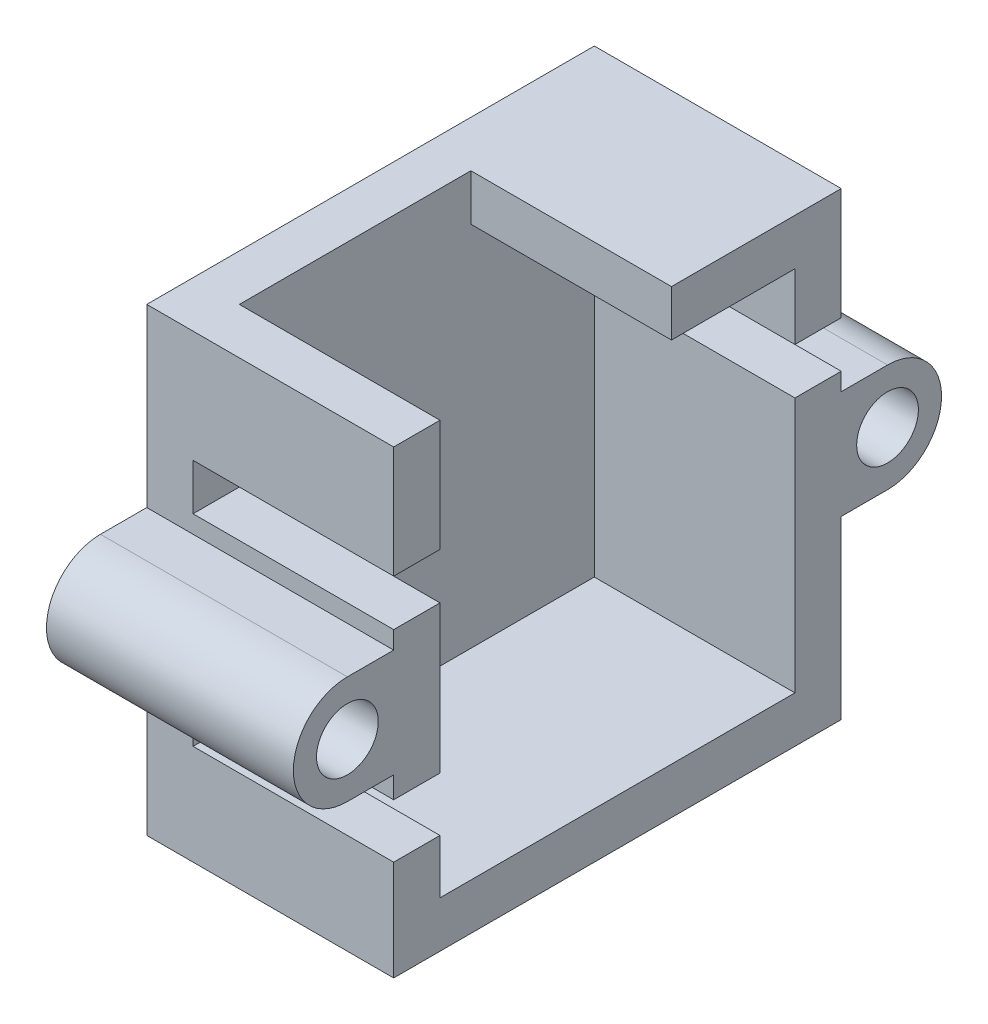
ISO-10303-21;
HEADER;
FILE_DESCRIPTION(('STEP AP214'),'2;1');
FILE_NAME('part.step','',(''),(''),'','','');
FILE_SCHEMA(('AUTOMOTIVE_DESIGN { 1 0 10303 214 1 1 1 1 }'));
ENDSEC;
DATA;
#1=APPLICATION_CONTEXT('core data for automotive mechanical design processes');
#2=APPLICATION_PROTOCOL_DEFINITION('international standard','automotive_design',2000,#1);
#3=PRODUCT_CONTEXT('',#1,'mechanical');
#4=PRODUCT('Part','Part','',(#3));
#5=PRODUCT_RELATED_PRODUCT_CATEGORY('part','',(#4));
#6=PRODUCT_DEFINITION_FORMATION('','',#4);
#7=PRODUCT_DEFINITION_CONTEXT('part definition',#1,'design');
#8=PRODUCT_DEFINITION('design','',#6,#7);
#9=PRODUCT_DEFINITION_SHAPE('','',#8);
#10=(LENGTH_UNIT() NAMED_UNIT(*) SI_UNIT(.MILLI.,.METRE.));
#11=(NAMED_UNIT(*) PLANE_ANGLE_UNIT() SI_UNIT($,.RADIAN.));
#12=(NAMED_UNIT(*) SI_UNIT($,.STERADIAN.) SOLID_ANGLE_UNIT());
#13=UNCERTAINTY_MEASURE_WITH_UNIT(LENGTH_MEASURE(1.E-05),#10,'distance_accuracy_value','');
#14=(GEOMETRIC_REPRESENTATION_CONTEXT(3) GLOBAL_UNCERTAINTY_ASSIGNED_CONTEXT((#13)) GLOBAL_UNIT_ASSIGNED_CONTEXT((#10,
#11,#12)) REPRESENTATION_CONTEXT('',''));
#15=CARTESIAN_POINT('',(0.,0.,0.));
#16=DIRECTION('',(0.,0.,1.));
#17=DIRECTION('',(1.,0.,0.));
#18=AXIS2_PLACEMENT_3D('',#15,#16,#17);
#19=CARTESIAN_POINT('',(13.,-3.,3.));
#20=DIRECTION('',(0.,0.,-1.));
#21=DIRECTION('',(-1.,0.,0.));
#22=AXIS2_PLACEMENT_3D('',#19,#20,#21);
#23=PLANE('',#22);
#24=DIRECTION('',(-1.,0.,0.));
#25=VECTOR('',#24,1.);
#26=CARTESIAN_POINT('',(22.5524865872714,15.4,3.));
#27=LINE('',#26,#25);
#28=CARTESIAN_POINT('',(13.,15.4,3.));
#29=VERTEX_POINT('',#28);
#30=CARTESIAN_POINT('',(-3.,15.4,3.));
#31=VERTEX_POINT('',#30);
#32=EDGE_CURVE('E333',#29,#31,#27,.T.);
#33=ORIENTED_EDGE('',*,*,#32,.F.);
#34=DIRECTION('',(0.,-1.,0.));
#35=VECTOR('',#34,1.);
#36=CARTESIAN_POINT('',(13.,-3.,3.));
#37=LINE('',#36,#35);
#38=CARTESIAN_POINT('',(13.,16.55,3.));
#39=VERTEX_POINT('',#38);
#40=EDGE_CURVE('E514',#39,#29,#37,.T.);
#41=ORIENTED_EDGE('',*,*,#40,.F.);
#42=DIRECTION('',(-1.,0.,0.));
#43=VECTOR('',#42,1.);
#44=CARTESIAN_POINT('',(42.1547594742265,16.55,3.));
#45=LINE('',#44,#43);
#46=CARTESIAN_POINT('',(0.,16.55,3.));
#47=VERTEX_POINT('',#46);
#48=EDGE_CURVE('E430',#39,#47,#45,.T.);
#49=ORIENTED_EDGE('',*,*,#48,.T.);
#50=DIRECTION('',(0.,-1.,0.));
#51=VECTOR('',#50,1.);
#52=CARTESIAN_POINT('',(0.,19.55,3.));
#53=LINE('',#52,#51);
#54=CARTESIAN_POINT('',(0.,19.55,3.));
#55=VERTEX_POINT('',#54);
#56=EDGE_CURVE('E425',#55,#47,#53,.T.);
#57=ORIENTED_EDGE('',*,*,#56,.F.);
#58=DIRECTION('',(-1.,0.,0.));
#59=VECTOR('',#58,1.);
#60=CARTESIAN_POINT('',(42.1547594742265,19.55,3.));
#61=LINE('',#60,#59);
#62=CARTESIAN_POINT('',(13.,19.55,3.));
#63=VERTEX_POINT('',#62);
#64=EDGE_CURVE('E402',#63,#55,#61,.T.);
#65=ORIENTED_EDGE('',*,*,#64,.F.);
#66=CARTESIAN_POINT('',(13.,26.8,3.));
#67=VERTEX_POINT('',#66);
#68=EDGE_CURVE('E508',#67,#63,#37,.T.);
#69=ORIENTED_EDGE('',*,*,#68,.F.);
#70=DIRECTION('',(-1.,0.,0.));
#71=VECTOR('',#70,1.);
#72=CARTESIAN_POINT('',(13.,26.8,3.));
#73=LINE('',#72,#71);
#74=CARTESIAN_POINT('',(-3.,26.8,3.));
#75=VERTEX_POINT('',#74);
#76=EDGE_CURVE('E520',#67,#75,#73,.T.);
#77=ORIENTED_EDGE('',*,*,#76,.T.);
#78=DIRECTION('',(0.,-1.,0.));
#79=VECTOR('',#78,1.);
#80=CARTESIAN_POINT('',(-3.,26.8,3.));
#81=LINE('',#80,#79);
#82=EDGE_CURVE('E448',#75,#31,#81,.T.);
#83=ORIENTED_EDGE('',*,*,#82,.T.);
#84=EDGE_LOOP('',(#33,#41,#49,#57,#65,#69,#77,#83));
#85=FACE_BOUND('',#84,.T.);
#86=ADVANCED_FACE('F100',(#85),#23,.F.);
#87=CARTESIAN_POINT('',(13.,-3.,-26.));
#88=DIRECTION('',(0.,0.,1.));
#89=DIRECTION('',(1.,0.,0.));
#90=AXIS2_PLACEMENT_3D('',#87,#88,#89);
#91=PLANE('',#90);
#92=DIRECTION('',(-1.,0.,0.));
#93=VECTOR('',#92,1.);
#94=CARTESIAN_POINT('',(22.5524865872714,8.4,-26.));
#95=LINE('',#94,#93);
#96=CARTESIAN_POINT('',(13.,8.4,-26.));
#97=VERTEX_POINT('',#96);
#98=CARTESIAN_POINT('',(-3.,8.4,-26.));
#99=VERTEX_POINT('',#98);
#100=EDGE_CURVE('E341',#97,#99,#95,.T.);
#101=ORIENTED_EDGE('',*,*,#100,.F.);
#102=DIRECTION('',(0.,1.,0.));
#103=VECTOR('',#102,1.);
#104=CARTESIAN_POINT('',(13.,-3.,-26.));
#105=LINE('',#104,#103);
#106=CARTESIAN_POINT('',(13.,-3.,-26.));
#107=VERTEX_POINT('',#106);
#108=EDGE_CURVE('E499',#107,#97,#105,.T.);
#109=ORIENTED_EDGE('',*,*,#108,.F.);
#110=DIRECTION('',(-1.,0.,0.));
#111=VECTOR('',#110,1.);
#112=CARTESIAN_POINT('',(13.,-3.,-26.));
#113=LINE('',#112,#111);
#114=CARTESIAN_POINT('',(-3.,-3.,-26.));
#115=VERTEX_POINT('',#114);
#116=EDGE_CURVE('E521',#107,#115,#113,.T.);
#117=ORIENTED_EDGE('',*,*,#116,.T.);
#118=DIRECTION('',(0.,1.,0.));
#119=VECTOR('',#118,1.);
#120=CARTESIAN_POINT('',(-3.,-3.,-26.));
#121=LINE('',#120,#119);
#122=EDGE_CURVE('E456',#115,#99,#121,.T.);
#123=ORIENTED_EDGE('',*,*,#122,.T.);
#124=EDGE_LOOP('',(#101,#109,#117,#123));
#125=FACE_BOUND('',#124,.T.);
#126=ADVANCED_FACE('F603',(#125),#91,.F.);
#127=CARTESIAN_POINT('',(13.,0.,0.));
#128=DIRECTION('',(1.,0.,0.));
#129=DIRECTION('',(0.,0.,-1.));
#130=AXIS2_PLACEMENT_3D('',#127,#128,#129);
#131=PLANE('',#130);
#132=DIRECTION('',(0.,-1.,0.));
#133=VECTOR('',#132,1.);
#134=CARTESIAN_POINT('',(13.,0.,0.));
#135=LINE('',#134,#133);
#136=CARTESIAN_POINT('',(13.,26.8,0.));
#137=VERTEX_POINT('',#136);
#138=CARTESIAN_POINT('',(13.,19.55,0.));
#139=VERTEX_POINT('',#138);
#140=EDGE_CURVE('E457',#137,#139,#135,.T.);
#141=ORIENTED_EDGE('',*,*,#140,.F.);
#142=DIRECTION('',(0.,0.,1.));
#143=VECTOR('',#142,1.);
#144=CARTESIAN_POINT('',(13.,26.8,3.));
#145=LINE('',#144,#143);
#146=EDGE_CURVE('E503',#137,#67,#145,.T.);
#147=ORIENTED_EDGE('',*,*,#146,.T.);
#148=ORIENTED_EDGE('',*,*,#68,.T.);
#149=DIRECTION('',(0.,0.,1.));
#150=VECTOR('',#149,1.);
#151=CARTESIAN_POINT('',(13.,19.55,3.));
#152=LINE('',#151,#150);
#153=EDGE_CURVE('E413',#139,#63,#152,.T.);
#154=ORIENTED_EDGE('',*,*,#153,.F.);
#155=EDGE_LOOP('',(#141,#147,#148,#154));
#156=FACE_BOUND('',#155,.T.);
#157=ADVANCED_FACE('F642',(#156),#131,.T.);
#158=CARTESIAN_POINT('',(13.,23.8,0.));
#159=DIRECTION('',(0.,-1.,0.));
#160=DIRECTION('',(0.,0.,-1.));
#161=AXIS2_PLACEMENT_3D('',#158,#159,#160);
#162=PLANE('',#161);
#163=DIRECTION('',(0.,0.,1.));
#164=VECTOR('',#163,1.);
#165=CARTESIAN_POINT('',(13.,23.8,0.));
#166=LINE('',#165,#164);
#167=CARTESIAN_POINT('',(13.,23.8,-23.));
#168=VERTEX_POINT('',#167);
#169=CARTESIAN_POINT('',(13.,23.8,-15.));
#170=VERTEX_POINT('',#169);
#171=EDGE_CURVE('E472',#168,#170,#166,.T.);
#172=ORIENTED_EDGE('',*,*,#171,.T.);
#173=DIRECTION('',(-1.,0.,0.));
#174=VECTOR('',#173,1.);
#175=CARTESIAN_POINT('',(28.2970585407784,23.8,-15.));
#176=LINE('',#175,#174);
#177=CARTESIAN_POINT('',(0.,23.8,-15.));
#178=VERTEX_POINT('',#177);
#179=EDGE_CURVE('E377',#170,#178,#176,.T.);
#180=ORIENTED_EDGE('',*,*,#179,.T.);
#181=DIRECTION('',(0.,0.,1.));
#182=VECTOR('',#181,1.);
#183=CARTESIAN_POINT('',(0.,23.8,0.));
#184=LINE('',#183,#182);
#185=CARTESIAN_POINT('',(0.,23.8,-23.));
#186=VERTEX_POINT('',#185);
#187=EDGE_CURVE('E488',#186,#178,#184,.T.);
#188=ORIENTED_EDGE('',*,*,#187,.F.);
#189=DIRECTION('',(-1.,0.,0.));
#190=VECTOR('',#189,1.);
#191=CARTESIAN_POINT('',(13.,23.8,-23.));
#192=LINE('',#191,#190);
#193=EDGE_CURVE('E471',#168,#186,#192,.T.);
#194=ORIENTED_EDGE('',*,*,#193,.F.);
#195=EDGE_LOOP('',(#172,#180,#188,#194));
#196=FACE_BOUND('',#195,.T.);
#197=ADVANCED_FACE('F539',(#196),#162,.T.);
#198=CARTESIAN_POINT('',(13.,26.8,3.));
#199=DIRECTION('',(0.,-1.,0.));
#200=DIRECTION('',(0.,0.,-1.));
#201=AXIS2_PLACEMENT_3D('',#198,#199,#200);
#202=PLANE('',#201);
#203=DIRECTION('',(-1.,0.,0.));
#204=VECTOR('',#203,1.);
#205=CARTESIAN_POINT('',(28.2970585407784,26.8,-15.));
#206=LINE('',#205,#204);
#207=CARTESIAN_POINT('',(13.,26.8,-15.));
#208=VERTEX_POINT('',#207);
#209=CARTESIAN_POINT('',(0.,26.8,-15.));
#210=VERTEX_POINT('',#209);
#211=EDGE_CURVE('E374',#208,#210,#206,.T.);
#212=ORIENTED_EDGE('',*,*,#211,.F.);
#213=CARTESIAN_POINT('',(13.,26.8,-26.));
#214=VERTEX_POINT('',#213);
#215=EDGE_CURVE('E504',#214,#208,#145,.T.);
#216=ORIENTED_EDGE('',*,*,#215,.F.);
#217=DIRECTION('',(-1.,0.,0.));
#218=VECTOR('',#217,1.);
#219=CARTESIAN_POINT('',(13.,26.8,-26.));
#220=LINE('',#219,#218);
#221=CARTESIAN_POINT('',(-3.,26.8,-26.));
#222=VERTEX_POINT('',#221);
#223=EDGE_CURVE('E516',#214,#222,#220,.T.);
#224=ORIENTED_EDGE('',*,*,#223,.T.);
#225=DIRECTION('',(0.,0.,1.));
#226=VECTOR('',#225,1.);
#227=CARTESIAN_POINT('',(-3.,26.8,-26.));
#228=LINE('',#227,#226);
#229=EDGE_CURVE('E450',#222,#75,#228,.T.);
#230=ORIENTED_EDGE('',*,*,#229,.T.);
#231=ORIENTED_EDGE('',*,*,#76,.F.);
#232=ORIENTED_EDGE('',*,*,#146,.F.);
#233=DIRECTION('',(-1.,0.,0.));
#234=VECTOR('',#233,1.);
#235=CARTESIAN_POINT('',(28.2970585407784,26.8,0.));
#236=LINE('',#235,#234);
#237=CARTESIAN_POINT('',(0.,26.8,0.));
#238=VERTEX_POINT('',#237);
#239=EDGE_CURVE('E332',#137,#238,#236,.T.);
#240=ORIENTED_EDGE('',*,*,#239,.T.);
#241=DIRECTION('',(0.,0.,1.));
#242=VECTOR('',#241,1.);
#243=CARTESIAN_POINT('',(0.,26.8,0.));
#244=LINE('',#243,#242);
#245=EDGE_CURVE('E371',#210,#238,#244,.T.);
#246=ORIENTED_EDGE('',*,*,#245,.F.);
#247=EDGE_LOOP('',(#212,#216,#224,#230,#231,#232,#240,#246));
#248=FACE_BOUND('',#247,.T.);
#249=ADVANCED_FACE('F619',(#248),#202,.F.);
#250=CARTESIAN_POINT('',(13.,0.,0.));
#251=DIRECTION('',(0.,0.,-1.));
#252=DIRECTION('',(-1.,0.,0.));
#253=AXIS2_PLACEMENT_3D('',#250,#251,#252);
#254=PLANE('',#253);
#255=CARTESIAN_POINT('',(13.,16.55,0.));
#256=VERTEX_POINT('',#255);
#257=CARTESIAN_POINT('',(13.,7.,0.));
#258=VERTEX_POINT('',#257);
#259=EDGE_CURVE('E462',#256,#258,#135,.T.);
#260=ORIENTED_EDGE('',*,*,#259,.T.);
#261=DIRECTION('',(-1.,0.,0.));
#262=VECTOR('',#261,1.);
#263=CARTESIAN_POINT('',(17.6097722286464,7.,0.));
#264=LINE('',#263,#262);
#265=CARTESIAN_POINT('',(0.,7.,0.));
#266=VERTEX_POINT('',#265);
#267=EDGE_CURVE('E388',#258,#266,#264,.T.);
#268=ORIENTED_EDGE('',*,*,#267,.T.);
#269=DIRECTION('',(0.,-1.,0.));
#270=VECTOR('',#269,1.);
#271=CARTESIAN_POINT('',(0.,0.,0.));
#272=LINE('',#271,#270);
#273=CARTESIAN_POINT('',(0.,16.55,0.));
#274=VERTEX_POINT('',#273);
#275=EDGE_CURVE('E478',#274,#266,#272,.T.);
#276=ORIENTED_EDGE('',*,*,#275,.F.);
#277=DIRECTION('',(1.,0.,0.));
#278=VECTOR('',#277,1.);
#279=CARTESIAN_POINT('',(13.,16.55,0.));
#280=LINE('',#279,#278);
#281=EDGE_CURVE('E443',#274,#256,#280,.T.);
#282=ORIENTED_EDGE('',*,*,#281,.T.);
#283=EDGE_LOOP('',(#260,#268,#276,#282));
#284=FACE_BOUND('',#283,.T.);
#285=ADVANCED_FACE('F574',(#284),#254,.T.);
#286=DIRECTION('',(0.,0.,1.));
#287=VECTOR('',#286,1.);
#288=CARTESIAN_POINT('',(13.,7.,3.));
#289=LINE('',#288,#287);
#290=CARTESIAN_POINT('',(13.,7.,3.));
#291=VERTEX_POINT('',#290);
#292=EDGE_CURVE('E386',#258,#291,#289,.T.);
#293=ORIENTED_EDGE('',*,*,#292,.F.);
#294=ORIENTED_EDGE('',*,*,#259,.F.);
#295=DIRECTION('',(0.,0.,-1.));
#296=VECTOR('',#295,1.);
#297=CARTESIAN_POINT('',(13.,16.55,3.));
#298=LINE('',#297,#296);
#299=EDGE_CURVE('E426',#39,#256,#298,.T.);
#300=ORIENTED_EDGE('',*,*,#299,.F.);
#301=ORIENTED_EDGE('',*,*,#40,.T.);
#302=DIRECTION('',(0.,0.,-1.));
#303=VECTOR('',#302,1.);
#304=CARTESIAN_POINT('',(13.,15.4,6.));
#305=LINE('',#304,#303);
#306=CARTESIAN_POINT('',(13.,15.4,6.));
#307=VERTEX_POINT('',#306);
#308=EDGE_CURVE('E331',#307,#29,#305,.T.);
#309=ORIENTED_EDGE('',*,*,#308,.F.);
#310=CARTESIAN_POINT('',(13.,11.9,6.));
#311=DIRECTION('',(1.,0.,0.));
#312=DIRECTION('',(0.,0.,-1.));
#313=AXIS2_PLACEMENT_3D('',#310,#311,#312);
#314=CIRCLE('',#313,3.5);
#315=CARTESIAN_POINT('',(13.,8.4,6.));
#316=VERTEX_POINT('',#315);
#317=EDGE_CURVE('E328',#307,#316,#314,.T.);
#318=ORIENTED_EDGE('',*,*,#317,.T.);
#319=DIRECTION('',(0.,0.,1.));
#320=VECTOR('',#319,1.);
#321=CARTESIAN_POINT('',(13.,8.4,3.));
#322=LINE('',#321,#320);
#323=CARTESIAN_POINT('',(13.,8.4,3.));
#324=VERTEX_POINT('',#323);
#325=EDGE_CURVE('E296',#324,#316,#322,.T.);
#326=ORIENTED_EDGE('',*,*,#325,.F.);
#327=EDGE_CURVE('E511',#324,#291,#37,.T.);
#328=ORIENTED_EDGE('',*,*,#327,.T.);
#329=EDGE_LOOP('',(#293,#294,#300,#301,#309,#318,#326,#328));
#330=FACE_BOUND('',#329,.T.);
#331=CARTESIAN_POINT('',(13.,11.9,6.));
#332=DIRECTION('',(1.,0.,0.));
#333=DIRECTION('',(0.,0.,-1.));
#334=AXIS2_PLACEMENT_3D('',#331,#332,#333);
#335=CIRCLE('',#334,2.);
#336=CARTESIAN_POINT('',(13.,11.9,8.));
#337=VERTEX_POINT('',#336);
#338=EDGE_CURVE('E321',#337,#337,#335,.T.);
#339=ORIENTED_EDGE('',*,*,#338,.F.);
#340=EDGE_LOOP('',(#339));
#341=FACE_BOUND('',#340,.T.);
#342=ADVANCED_FACE('F582',(#330,#341),#131,.T.);
#343=ORIENTED_EDGE('',*,*,#327,.F.);
#344=DIRECTION('',(-1.,0.,0.));
#345=VECTOR('',#344,1.);
#346=CARTESIAN_POINT('',(22.5524865872714,8.4,3.));
#347=LINE('',#346,#345);
#348=CARTESIAN_POINT('',(-3.,8.4,3.));
#349=VERTEX_POINT('',#348);
#350=EDGE_CURVE('E303',#324,#349,#347,.T.);
#351=ORIENTED_EDGE('',*,*,#350,.T.);
#352=CARTESIAN_POINT('',(-3.,-3.,3.));
#353=VERTEX_POINT('',#352);
#354=EDGE_CURVE('E314',#349,#353,#81,.T.);
#355=ORIENTED_EDGE('',*,*,#354,.T.);
#356=DIRECTION('',(-1.,0.,0.));
#357=VECTOR('',#356,1.);
#358=CARTESIAN_POINT('',(13.,-3.,3.));
#359=LINE('',#358,#357);
#360=CARTESIAN_POINT('',(13.,-3.,3.));
#361=VERTEX_POINT('',#360);
#362=EDGE_CURVE('E515',#361,#353,#359,.T.);
#363=ORIENTED_EDGE('',*,*,#362,.F.);
#364=CARTESIAN_POINT('',(13.,3.5,3.));
#365=VERTEX_POINT('',#364);
#366=EDGE_CURVE('E507',#365,#361,#37,.T.);
#367=ORIENTED_EDGE('',*,*,#366,.F.);
#368=DIRECTION('',(-1.,0.,0.));
#369=VECTOR('',#368,1.);
#370=CARTESIAN_POINT('',(17.6097722286464,3.5,3.));
#371=LINE('',#370,#369);
#372=CARTESIAN_POINT('',(0.,3.5,3.));
#373=VERTEX_POINT('',#372);
#374=EDGE_CURVE('E392',#365,#373,#371,.T.);
#375=ORIENTED_EDGE('',*,*,#374,.T.);
#376=DIRECTION('',(0.,-1.,0.));
#377=VECTOR('',#376,1.);
#378=CARTESIAN_POINT('',(0.,3.5,3.));
#379=LINE('',#378,#377);
#380=CARTESIAN_POINT('',(0.,7.,3.));
#381=VERTEX_POINT('',#380);
#382=EDGE_CURVE('E396',#381,#373,#379,.T.);
#383=ORIENTED_EDGE('',*,*,#382,.F.);
#384=DIRECTION('',(-1.,0.,0.));
#385=VECTOR('',#384,1.);
#386=CARTESIAN_POINT('',(17.6097722286464,7.,3.));
#387=LINE('',#386,#385);
#388=EDGE_CURVE('E379',#291,#381,#387,.T.);
#389=ORIENTED_EDGE('',*,*,#388,.F.);
#390=EDGE_LOOP('',(#343,#351,#355,#363,#367,#375,#383,#389));
#391=FACE_BOUND('',#390,.T.);
#392=ADVANCED_FACE('F591',(#391),#23,.F.);
#393=DIRECTION('',(0.,1.,0.));
#394=VECTOR('',#393,1.);
#395=CARTESIAN_POINT('',(13.,23.8,-15.));
#396=LINE('',#395,#394);
#397=EDGE_CURVE('E372',#170,#208,#396,.T.);
#398=ORIENTED_EDGE('',*,*,#397,.F.);
#399=ORIENTED_EDGE('',*,*,#171,.F.);
#400=DIRECTION('',(0.,1.,0.));
#401=VECTOR('',#400,1.);
#402=CARTESIAN_POINT('',(13.,0.,-23.));
#403=LINE('',#402,#401);
#404=CARTESIAN_POINT('',(13.,19.55,-23.));
#405=VERTEX_POINT('',#404);
#406=EDGE_CURVE('E470',#405,#168,#403,.T.);
#407=ORIENTED_EDGE('',*,*,#406,.F.);
#408=CARTESIAN_POINT('',(13.,19.55,-26.));
#409=VERTEX_POINT('',#408);
#410=EDGE_CURVE('E435',#409,#405,#152,.T.);
#411=ORIENTED_EDGE('',*,*,#410,.F.);
#412=EDGE_CURVE('E497',#409,#214,#105,.T.);
#413=ORIENTED_EDGE('',*,*,#412,.T.);
#414=ORIENTED_EDGE('',*,*,#215,.T.);
#415=EDGE_LOOP('',(#398,#399,#407,#411,#413,#414));
#416=FACE_BOUND('',#415,.T.);
#417=ADVANCED_FACE('F533',(#416),#131,.T.);
#418=CARTESIAN_POINT('',(13.,15.4,-26.));
#419=VERTEX_POINT('',#418);
#420=CARTESIAN_POINT('',(13.,16.55,-26.));
#421=VERTEX_POINT('',#420);
#422=EDGE_CURVE('E502',#419,#421,#105,.T.);
#423=ORIENTED_EDGE('',*,*,#422,.F.);
#424=DIRECTION('',(-1.,0.,0.));
#425=VECTOR('',#424,1.);
#426=CARTESIAN_POINT('',(22.5524865872714,15.4,-26.));
#427=LINE('',#426,#425);
#428=CARTESIAN_POINT('',(-3.,15.4,-26.));
#429=VERTEX_POINT('',#428);
#430=EDGE_CURVE('E125',#419,#429,#427,.T.);
#431=ORIENTED_EDGE('',*,*,#430,.T.);
#432=EDGE_CURVE('E459',#429,#222,#121,.T.);
#433=ORIENTED_EDGE('',*,*,#432,.T.);
#434=ORIENTED_EDGE('',*,*,#223,.F.);
#435=ORIENTED_EDGE('',*,*,#412,.F.);
#436=DIRECTION('',(-1.,0.,0.));
#437=VECTOR('',#436,1.);
#438=CARTESIAN_POINT('',(42.1547594742265,19.55,-26.));
#439=LINE('',#438,#437);
#440=CARTESIAN_POINT('',(0.,19.55,-26.));
#441=VERTEX_POINT('',#440);
#442=EDGE_CURVE('E418',#409,#441,#439,.T.);
#443=ORIENTED_EDGE('',*,*,#442,.T.);
#444=DIRECTION('',(0.,1.,0.));
#445=VECTOR('',#444,1.);
#446=CARTESIAN_POINT('',(0.,19.55,-26.));
#447=LINE('',#446,#445);
#448=CARTESIAN_POINT('',(0.,16.55,-26.));
#449=VERTEX_POINT('',#448);
#450=EDGE_CURVE('E416',#449,#441,#447,.T.);
#451=ORIENTED_EDGE('',*,*,#450,.F.);
#452=DIRECTION('',(-1.,0.,0.));
#453=VECTOR('',#452,1.);
#454=CARTESIAN_POINT('',(42.1547594742265,16.55,-26.));
#455=LINE('',#454,#453);
#456=EDGE_CURVE('E417',#421,#449,#455,.T.);
#457=ORIENTED_EDGE('',*,*,#456,.F.);
#458=EDGE_LOOP('',(#423,#431,#433,#434,#435,#443,#451,#457));
#459=FACE_BOUND('',#458,.T.);
#460=ADVANCED_FACE('F543',(#459),#91,.F.);
#461=DIRECTION('',(-1.,0.,0.));
#462=VECTOR('',#461,1.);
#463=CARTESIAN_POINT('',(17.6097722286464,3.5,0.));
#464=LINE('',#463,#462);
#465=CARTESIAN_POINT('',(13.,3.5,0.));
#466=VERTEX_POINT('',#465);
#467=CARTESIAN_POINT('',(0.,3.5,0.));
#468=VERTEX_POINT('',#467);
#469=EDGE_CURVE('E393',#466,#468,#464,.T.);
#470=ORIENTED_EDGE('',*,*,#469,.F.);
#471=CARTESIAN_POINT('',(13.,0.,0.));
#472=VERTEX_POINT('',#471);
#473=EDGE_CURVE('E464',#466,#472,#135,.T.);
#474=ORIENTED_EDGE('',*,*,#473,.T.);
#475=DIRECTION('',(-1.,0.,0.));
#476=VECTOR('',#475,1.);
#477=CARTESIAN_POINT('',(13.,0.,0.));
#478=LINE('',#477,#476);
#479=CARTESIAN_POINT('',(0.,0.,0.));
#480=VERTEX_POINT('',#479);
#481=EDGE_CURVE('E491',#472,#480,#478,.T.);
#482=ORIENTED_EDGE('',*,*,#481,.T.);
#483=EDGE_CURVE('E458',#468,#480,#272,.T.);
#484=ORIENTED_EDGE('',*,*,#483,.F.);
#485=EDGE_LOOP('',(#470,#474,#482,#484));
#486=FACE_BOUND('',#485,.T.);
#487=ADVANCED_FACE('F569',(#486),#254,.T.);
#488=ORIENTED_EDGE('',*,*,#140,.T.);
#489=DIRECTION('',(-1.,0.,0.));
#490=VECTOR('',#489,1.);
#491=CARTESIAN_POINT('',(13.,19.55,0.));
#492=LINE('',#491,#490);
#493=CARTESIAN_POINT('',(0.,19.55,0.));
#494=VERTEX_POINT('',#493);
#495=EDGE_CURVE('E427',#139,#494,#492,.T.);
#496=ORIENTED_EDGE('',*,*,#495,.T.);
#497=EDGE_CURVE('E473',#238,#494,#272,.T.);
#498=ORIENTED_EDGE('',*,*,#497,.F.);
#499=ORIENTED_EDGE('',*,*,#239,.F.);
#500=EDGE_LOOP('',(#488,#496,#498,#499));
#501=FACE_BOUND('',#500,.T.);
#502=ADVANCED_FACE('F653',(#501),#254,.T.);
#503=CARTESIAN_POINT('',(13.,0.,-23.));
#504=DIRECTION('',(0.,0.,1.));
#505=DIRECTION('',(1.,0.,0.));
#506=AXIS2_PLACEMENT_3D('',#503,#504,#505);
#507=PLANE('',#506);
#508=CARTESIAN_POINT('',(13.,0.,-23.));
#509=VERTEX_POINT('',#508);
#510=CARTESIAN_POINT('',(13.,16.55,-23.));
#511=VERTEX_POINT('',#510);
#512=EDGE_CURVE('E466',#509,#511,#403,.T.);
#513=ORIENTED_EDGE('',*,*,#512,.T.);
#514=DIRECTION('',(-1.,0.,0.));
#515=VECTOR('',#514,1.);
#516=CARTESIAN_POINT('',(13.,16.55,-23.));
#517=LINE('',#516,#515);
#518=CARTESIAN_POINT('',(0.,16.55,-23.));
#519=VERTEX_POINT('',#518);
#520=EDGE_CURVE('E12',#511,#519,#517,.T.);
#521=ORIENTED_EDGE('',*,*,#520,.T.);
#522=DIRECTION('',(0.,1.,0.));
#523=VECTOR('',#522,1.);
#524=CARTESIAN_POINT('',(0.,0.,-23.));
#525=LINE('',#524,#523);
#526=CARTESIAN_POINT('',(0.,0.,-23.));
#527=VERTEX_POINT('',#526);
#528=EDGE_CURVE('E483',#527,#519,#525,.T.);
#529=ORIENTED_EDGE('',*,*,#528,.F.);
#530=DIRECTION('',(-1.,0.,0.));
#531=VECTOR('',#530,1.);
#532=CARTESIAN_POINT('',(13.,0.,-23.));
#533=LINE('',#532,#531);
#534=EDGE_CURVE('E493',#509,#527,#533,.T.);
#535=ORIENTED_EDGE('',*,*,#534,.F.);
#536=EDGE_LOOP('',(#513,#521,#529,#535));
#537=FACE_BOUND('',#536,.T.);
#538=ADVANCED_FACE('F557',(#537),#507,.T.);
#539=CARTESIAN_POINT('',(0.,19.55,-23.));
#540=VERTEX_POINT('',#539);
#541=EDGE_CURVE('E485',#540,#186,#525,.T.);
#542=ORIENTED_EDGE('',*,*,#541,.F.);
#543=DIRECTION('',(1.,0.,0.));
#544=VECTOR('',#543,1.);
#545=CARTESIAN_POINT('',(13.,19.55,-23.));
#546=LINE('',#545,#544);
#547=EDGE_CURVE('E110',#540,#405,#546,.T.);
#548=ORIENTED_EDGE('',*,*,#547,.T.);
#549=ORIENTED_EDGE('',*,*,#406,.T.);
#550=ORIENTED_EDGE('',*,*,#193,.T.);
#551=EDGE_LOOP('',(#542,#548,#549,#550));
#552=FACE_BOUND('',#551,.T.);
#553=ADVANCED_FACE('F530',(#552),#507,.T.);
#554=DIRECTION('',(0.,0.,-1.));
#555=VECTOR('',#554,1.);
#556=CARTESIAN_POINT('',(13.,3.5,3.));
#557=LINE('',#556,#555);
#558=EDGE_CURVE('E397',#365,#466,#557,.T.);
#559=ORIENTED_EDGE('',*,*,#558,.F.);
#560=ORIENTED_EDGE('',*,*,#366,.T.);
#561=DIRECTION('',(0.,0.,-1.));
#562=VECTOR('',#561,1.);
#563=CARTESIAN_POINT('',(13.,-3.,3.));
#564=LINE('',#563,#562);
#565=EDGE_CURVE('E496',#361,#107,#564,.T.);
#566=ORIENTED_EDGE('',*,*,#565,.T.);
#567=ORIENTED_EDGE('',*,*,#108,.T.);
#568=DIRECTION('',(0.,0.,-1.));
#569=VECTOR('',#568,1.);
#570=CARTESIAN_POINT('',(13.,8.4,-26.));
#571=LINE('',#570,#569);
#572=CARTESIAN_POINT('',(13.,8.4,-29.));
#573=VERTEX_POINT('',#572);
#574=EDGE_CURVE('E347',#97,#573,#571,.T.);
#575=ORIENTED_EDGE('',*,*,#574,.T.);
#576=CARTESIAN_POINT('',(13.,11.9,-29.));
#577=DIRECTION('',(1.,0.,0.));
#578=DIRECTION('',(0.,0.,-1.));
#579=AXIS2_PLACEMENT_3D('',#576,#577,#578);
#580=CIRCLE('',#579,3.5);
#581=CARTESIAN_POINT('',(13.,15.4,-29.));
#582=VERTEX_POINT('',#581);
#583=EDGE_CURVE('E345',#582,#573,#580,.F.);
#584=ORIENTED_EDGE('',*,*,#583,.F.);
#585=DIRECTION('',(0.,0.,1.));
#586=VECTOR('',#585,1.);
#587=CARTESIAN_POINT('',(13.,15.4,-29.));
#588=LINE('',#587,#586);
#589=EDGE_CURVE('E346',#582,#419,#588,.T.);
#590=ORIENTED_EDGE('',*,*,#589,.T.);
#591=ORIENTED_EDGE('',*,*,#422,.T.);
#592=EDGE_CURVE('E431',#511,#421,#298,.T.);
#593=ORIENTED_EDGE('',*,*,#592,.F.);
#594=ORIENTED_EDGE('',*,*,#512,.F.);
#595=DIRECTION('',(0.,0.,-1.));
#596=VECTOR('',#595,1.);
#597=CARTESIAN_POINT('',(13.,0.,0.));
#598=LINE('',#597,#596);
#599=EDGE_CURVE('E463',#472,#509,#598,.T.);
#600=ORIENTED_EDGE('',*,*,#599,.F.);
#601=ORIENTED_EDGE('',*,*,#473,.F.);
#602=EDGE_LOOP('',(#559,#560,#566,#567,#575,#584,#590,#591,#593,#594,#600,#601));
#603=FACE_BOUND('',#602,.T.);
#604=CARTESIAN_POINT('',(13.,11.9,-29.));
#605=DIRECTION('',(1.,0.,0.));
#606=DIRECTION('',(0.,0.,-1.));
#607=AXIS2_PLACEMENT_3D('',#604,#605,#606);
#608=CIRCLE('',#607,2.);
#609=CARTESIAN_POINT('',(13.,11.9,-27.));
#610=VERTEX_POINT('',#609);
#611=EDGE_CURVE('E353',#610,#610,#608,.F.);
#612=ORIENTED_EDGE('',*,*,#611,.T.);
#613=EDGE_LOOP('',(#612));
#614=FACE_BOUND('',#613,.T.);
#615=ADVANCED_FACE('F552',(#603,#614),#131,.T.);
#616=CARTESIAN_POINT('',(13.,-3.,3.));
#617=DIRECTION('',(0.,1.,0.));
#618=DIRECTION('',(0.,0.,1.));
#619=AXIS2_PLACEMENT_3D('',#616,#617,#618);
#620=PLANE('',#619);
#621=ORIENTED_EDGE('',*,*,#362,.T.);
#622=DIRECTION('',(0.,0.,-1.));
#623=VECTOR('',#622,1.);
#624=CARTESIAN_POINT('',(-3.,-3.,3.));
#625=LINE('',#624,#623);
#626=EDGE_CURVE('E454',#353,#115,#625,.T.);
#627=ORIENTED_EDGE('',*,*,#626,.T.);
#628=ORIENTED_EDGE('',*,*,#116,.F.);
#629=ORIENTED_EDGE('',*,*,#565,.F.);
#630=EDGE_LOOP('',(#621,#627,#628,#629));
#631=FACE_BOUND('',#630,.T.);
#632=ADVANCED_FACE('F103',(#631),#620,.F.);
#633=CARTESIAN_POINT('',(13.,0.,0.));
#634=DIRECTION('',(0.,1.,0.));
#635=DIRECTION('',(0.,0.,1.));
#636=AXIS2_PLACEMENT_3D('',#633,#634,#635);
#637=PLANE('',#636);
#638=DIRECTION('',(0.,0.,-1.));
#639=VECTOR('',#638,1.);
#640=CARTESIAN_POINT('',(0.,0.,0.));
#641=LINE('',#640,#639);
#642=EDGE_CURVE('E480',#480,#527,#641,.T.);
#643=ORIENTED_EDGE('',*,*,#642,.F.);
#644=ORIENTED_EDGE('',*,*,#481,.F.);
#645=ORIENTED_EDGE('',*,*,#599,.T.);
#646=ORIENTED_EDGE('',*,*,#534,.T.);
#647=EDGE_LOOP('',(#643,#644,#645,#646));
#648=FACE_BOUND('',#647,.T.);
#649=ADVANCED_FACE('F566',(#648),#637,.T.);
#650=CARTESIAN_POINT('',(0.,0.,0.));
#651=DIRECTION('',(1.,0.,0.));
#652=DIRECTION('',(0.,0.,-1.));
#653=AXIS2_PLACEMENT_3D('',#650,#651,#652);
#654=PLANE('',#653);
#655=ORIENTED_EDGE('',*,*,#528,.T.);
#656=DIRECTION('',(0.,0.,-1.));
#657=VECTOR('',#656,1.);
#658=CARTESIAN_POINT('',(0.,16.55,3.));
#659=LINE('',#658,#657);
#660=EDGE_CURVE('E421',#519,#449,#659,.T.);
#661=ORIENTED_EDGE('',*,*,#660,.T.);
#662=ORIENTED_EDGE('',*,*,#450,.T.);
#663=DIRECTION('',(0.,0.,1.));
#664=VECTOR('',#663,1.);
#665=CARTESIAN_POINT('',(0.,19.55,3.));
#666=LINE('',#665,#664);
#667=EDGE_CURVE('E414',#441,#540,#666,.T.);
#668=ORIENTED_EDGE('',*,*,#667,.T.);
#669=ORIENTED_EDGE('',*,*,#541,.T.);
#670=ORIENTED_EDGE('',*,*,#187,.T.);
#671=DIRECTION('',(0.,1.,0.));
#672=VECTOR('',#671,1.);
#673=CARTESIAN_POINT('',(0.,23.8,-15.));
#674=LINE('',#673,#672);
#675=EDGE_CURVE('E376',#178,#210,#674,.T.);
#676=ORIENTED_EDGE('',*,*,#675,.T.);
#677=ORIENTED_EDGE('',*,*,#245,.T.);
#678=ORIENTED_EDGE('',*,*,#497,.T.);
#679=EDGE_CURVE('E412',#494,#55,#666,.T.);
#680=ORIENTED_EDGE('',*,*,#679,.T.);
#681=ORIENTED_EDGE('',*,*,#56,.T.);
#682=EDGE_CURVE('E419',#47,#274,#659,.T.);
#683=ORIENTED_EDGE('',*,*,#682,.T.);
#684=ORIENTED_EDGE('',*,*,#275,.T.);
#685=DIRECTION('',(0.,0.,1.));
#686=VECTOR('',#685,1.);
#687=CARTESIAN_POINT('',(0.,7.,3.));
#688=LINE('',#687,#686);
#689=EDGE_CURVE('E390',#266,#381,#688,.T.);
#690=ORIENTED_EDGE('',*,*,#689,.T.);
#691=ORIENTED_EDGE('',*,*,#382,.T.);
#692=DIRECTION('',(0.,0.,-1.));
#693=VECTOR('',#692,1.);
#694=CARTESIAN_POINT('',(0.,3.5,3.));
#695=LINE('',#694,#693);
#696=EDGE_CURVE('E394',#373,#468,#695,.T.);
#697=ORIENTED_EDGE('',*,*,#696,.T.);
#698=ORIENTED_EDGE('',*,*,#483,.T.);
#699=ORIENTED_EDGE('',*,*,#642,.T.);
#700=EDGE_LOOP('',(#655,#661,#662,#668,#669,#670,#676,#677,#678,#680,#681,#683,#684,#690,#691,
#697,#698,#699));
#701=FACE_BOUND('',#700,.T.);
#702=ADVANCED_FACE('F544',(#701),#654,.T.);
#703=CARTESIAN_POINT('',(-3.,0.,0.));
#704=DIRECTION('',(1.,0.,0.));
#705=DIRECTION('',(0.,0.,-1.));
#706=AXIS2_PLACEMENT_3D('',#703,#704,#705);
#707=PLANE('',#706);
#708=ORIENTED_EDGE('',*,*,#229,.F.);
#709=ORIENTED_EDGE('',*,*,#432,.F.);
#710=DIRECTION('',(0.,0.,-1.));
#711=VECTOR('',#710,1.);
#712=CARTESIAN_POINT('',(-3.,15.4,-29.));
#713=LINE('',#712,#711);
#714=CARTESIAN_POINT('',(-3.,15.4,-29.));
#715=VERTEX_POINT('',#714);
#716=EDGE_CURVE('E358',#429,#715,#713,.T.);
#717=ORIENTED_EDGE('',*,*,#716,.T.);
#718=CARTESIAN_POINT('',(-3.,11.9,-29.));
#719=DIRECTION('',(1.,0.,0.));
#720=DIRECTION('',(0.,0.,-1.));
#721=AXIS2_PLACEMENT_3D('',#718,#719,#720);
#722=CIRCLE('',#721,3.5);
#723=CARTESIAN_POINT('',(-3.,8.4,-29.));
#724=VERTEX_POINT('',#723);
#725=EDGE_CURVE('E320',#724,#715,#722,.T.);
#726=ORIENTED_EDGE('',*,*,#725,.F.);
#727=DIRECTION('',(0.,0.,1.));
#728=VECTOR('',#727,1.);
#729=CARTESIAN_POINT('',(-3.,8.4,-26.));
#730=LINE('',#729,#728);
#731=EDGE_CURVE('E364',#724,#99,#730,.T.);
#732=ORIENTED_EDGE('',*,*,#731,.T.);
#733=ORIENTED_EDGE('',*,*,#122,.F.);
#734=ORIENTED_EDGE('',*,*,#626,.F.);
#735=ORIENTED_EDGE('',*,*,#354,.F.);
#736=DIRECTION('',(0.,0.,-1.));
#737=VECTOR('',#736,1.);
#738=CARTESIAN_POINT('',(-3.,8.4,3.));
#739=LINE('',#738,#737);
#740=CARTESIAN_POINT('',(-3.,8.4,6.));
#741=VERTEX_POINT('',#740);
#742=EDGE_CURVE('E112',#741,#349,#739,.T.);
#743=ORIENTED_EDGE('',*,*,#742,.F.);
#744=CARTESIAN_POINT('',(-3.,11.9,6.));
#745=DIRECTION('',(1.,0.,0.));
#746=DIRECTION('',(0.,0.,-1.));
#747=AXIS2_PLACEMENT_3D('',#744,#745,#746);
#748=CIRCLE('',#747,3.5);
#749=CARTESIAN_POINT('',(-3.,15.4,6.));
#750=VERTEX_POINT('',#749);
#751=EDGE_CURVE('E315',#741,#750,#748,.F.);
#752=ORIENTED_EDGE('',*,*,#751,.T.);
#753=DIRECTION('',(0.,0.,1.));
#754=VECTOR('',#753,1.);
#755=CARTESIAN_POINT('',(-3.,15.4,6.));
#756=LINE('',#755,#754);
#757=EDGE_CURVE('E317',#31,#750,#756,.T.);
#758=ORIENTED_EDGE('',*,*,#757,.F.);
#759=ORIENTED_EDGE('',*,*,#82,.F.);
#760=EDGE_LOOP('',(#708,#709,#717,#726,#732,#733,#734,#735,#743,#752,#758,#759));
#761=FACE_BOUND('',#760,.T.);
#762=CARTESIAN_POINT('',(-3.,11.9,-29.));
#763=DIRECTION('',(1.,0.,0.));
#764=DIRECTION('',(0.,0.,-1.));
#765=AXIS2_PLACEMENT_3D('',#762,#763,#764);
#766=CIRCLE('',#765,2.);
#767=CARTESIAN_POINT('',(-3.,11.9,-27.));
#768=VERTEX_POINT('',#767);
#769=EDGE_CURVE('E363',#768,#768,#766,.T.);
#770=ORIENTED_EDGE('',*,*,#769,.T.);
#771=EDGE_LOOP('',(#770));
#772=FACE_BOUND('',#771,.T.);
#773=CARTESIAN_POINT('',(-3.,11.9,6.));
#774=DIRECTION('',(1.,0.,0.));
#775=DIRECTION('',(0.,0.,-1.));
#776=AXIS2_PLACEMENT_3D('',#773,#774,#775);
#777=CIRCLE('',#776,2.);
#778=CARTESIAN_POINT('',(-3.,11.9,8.));
#779=VERTEX_POINT('',#778);
#780=EDGE_CURVE('E322',#779,#779,#777,.F.);
#781=ORIENTED_EDGE('',*,*,#780,.F.);
#782=EDGE_LOOP('',(#781));
#783=FACE_BOUND('',#782,.T.);
#784=ADVANCED_FACE('F307',(#761,#772,#783),#707,.F.);
#785=CARTESIAN_POINT('',(42.1547594742265,19.55,3.));
#786=DIRECTION('',(0.,-1.,0.));
#787=DIRECTION('',(0.,0.,-1.));
#788=AXIS2_PLACEMENT_3D('',#785,#786,#787);
#789=PLANE('',#788);
#790=ORIENTED_EDGE('',*,*,#667,.F.);
#791=ORIENTED_EDGE('',*,*,#442,.F.);
#792=ORIENTED_EDGE('',*,*,#410,.T.);
#793=ORIENTED_EDGE('',*,*,#547,.F.);
#794=EDGE_LOOP('',(#790,#791,#792,#793));
#795=FACE_BOUND('',#794,.T.);
#796=ADVANCED_FACE('F545',(#795),#789,.T.);
#797=CARTESIAN_POINT('',(42.1547594742265,16.55,3.));
#798=DIRECTION('',(0.,1.,0.));
#799=DIRECTION('',(0.,0.,1.));
#800=AXIS2_PLACEMENT_3D('',#797,#798,#799);
#801=PLANE('',#800);
#802=ORIENTED_EDGE('',*,*,#592,.T.);
#803=ORIENTED_EDGE('',*,*,#456,.T.);
#804=ORIENTED_EDGE('',*,*,#660,.F.);
#805=ORIENTED_EDGE('',*,*,#520,.F.);
#806=EDGE_LOOP('',(#802,#803,#804,#805));
#807=FACE_BOUND('',#806,.T.);
#808=ADVANCED_FACE('F560',(#807),#801,.T.);
#809=ORIENTED_EDGE('',*,*,#682,.F.);
#810=ORIENTED_EDGE('',*,*,#48,.F.);
#811=ORIENTED_EDGE('',*,*,#299,.T.);
#812=ORIENTED_EDGE('',*,*,#281,.F.);
#813=EDGE_LOOP('',(#809,#810,#811,#812));
#814=FACE_BOUND('',#813,.T.);
#815=ADVANCED_FACE('F594',(#814),#801,.T.);
#816=ORIENTED_EDGE('',*,*,#153,.T.);
#817=ORIENTED_EDGE('',*,*,#64,.T.);
#818=ORIENTED_EDGE('',*,*,#679,.F.);
#819=ORIENTED_EDGE('',*,*,#495,.F.);
#820=EDGE_LOOP('',(#816,#817,#818,#819));
#821=FACE_BOUND('',#820,.T.);
#822=ADVANCED_FACE('F837',(#821),#789,.T.);
#823=CARTESIAN_POINT('',(17.6097722286464,3.5,3.));
#824=DIRECTION('',(0.,1.,0.));
#825=DIRECTION('',(0.,0.,1.));
#826=AXIS2_PLACEMENT_3D('',#823,#824,#825);
#827=PLANE('',#826);
#828=ORIENTED_EDGE('',*,*,#558,.T.);
#829=ORIENTED_EDGE('',*,*,#469,.T.);
#830=ORIENTED_EDGE('',*,*,#696,.F.);
#831=ORIENTED_EDGE('',*,*,#374,.F.);
#832=EDGE_LOOP('',(#828,#829,#830,#831));
#833=FACE_BOUND('',#832,.T.);
#834=ADVANCED_FACE('F632',(#833),#827,.T.);
#835=CARTESIAN_POINT('',(17.6097722286464,7.,3.));
#836=DIRECTION('',(0.,-1.,0.));
#837=DIRECTION('',(0.,0.,-1.));
#838=AXIS2_PLACEMENT_3D('',#835,#836,#837);
#839=PLANE('',#838);
#840=ORIENTED_EDGE('',*,*,#292,.T.);
#841=ORIENTED_EDGE('',*,*,#388,.T.);
#842=ORIENTED_EDGE('',*,*,#689,.F.);
#843=ORIENTED_EDGE('',*,*,#267,.F.);
#844=EDGE_LOOP('',(#840,#841,#842,#843));
#845=FACE_BOUND('',#844,.T.);
#846=ADVANCED_FACE('F590',(#845),#839,.T.);
#847=CARTESIAN_POINT('',(28.2970585407784,23.8,-15.));
#848=DIRECTION('',(0.,0.,1.));
#849=DIRECTION('',(1.,0.,0.));
#850=AXIS2_PLACEMENT_3D('',#847,#848,#849);
#851=PLANE('',#850);
#852=ORIENTED_EDGE('',*,*,#397,.T.);
#853=ORIENTED_EDGE('',*,*,#211,.T.);
#854=ORIENTED_EDGE('',*,*,#675,.F.);
#855=ORIENTED_EDGE('',*,*,#179,.F.);
#856=EDGE_LOOP('',(#852,#853,#854,#855));
#857=FACE_BOUND('',#856,.T.);
#858=ADVANCED_FACE('F624',(#857),#851,.T.);
#859=CARTESIAN_POINT('',(22.5524865872714,11.9,-29.));
#860=DIRECTION('',(-1.,0.,0.));
#861=DIRECTION('',(0.,0.,1.));
#862=AXIS2_PLACEMENT_3D('',#859,#860,#861);
#863=CYLINDRICAL_SURFACE('',#862,3.5);
#864=DIRECTION('',(-1.,0.,0.));
#865=VECTOR('',#864,1.);
#866=CARTESIAN_POINT('',(22.5524865872714,15.4,-29.));
#867=LINE('',#866,#865);
#868=EDGE_CURVE('E344',#582,#715,#867,.T.);
#869=ORIENTED_EDGE('',*,*,#868,.F.);
#870=ORIENTED_EDGE('',*,*,#583,.T.);
#871=DIRECTION('',(-1.,0.,0.));
#872=VECTOR('',#871,1.);
#873=CARTESIAN_POINT('',(22.5524865872714,8.4,-29.));
#874=LINE('',#873,#872);
#875=EDGE_CURVE('E338',#573,#724,#874,.T.);
#876=ORIENTED_EDGE('',*,*,#875,.T.);
#877=ORIENTED_EDGE('',*,*,#725,.T.);
#878=EDGE_LOOP('',(#869,#870,#876,#877));
#879=FACE_BOUND('',#878,.T.);
#880=ADVANCED_FACE('F613',(#879),#863,.T.);
#881=CARTESIAN_POINT('',(22.5524865872714,15.4,-29.));
#882=DIRECTION('',(0.,-1.,0.));
#883=DIRECTION('',(0.,0.,-1.));
#884=AXIS2_PLACEMENT_3D('',#881,#882,#883);
#885=PLANE('',#884);
#886=ORIENTED_EDGE('',*,*,#589,.F.);
#887=ORIENTED_EDGE('',*,*,#868,.T.);
#888=ORIENTED_EDGE('',*,*,#716,.F.);
#889=ORIENTED_EDGE('',*,*,#430,.F.);
#890=EDGE_LOOP('',(#886,#887,#888,#889));
#891=FACE_BOUND('',#890,.T.);
#892=ADVANCED_FACE('F618',(#891),#885,.F.);
#893=CARTESIAN_POINT('',(22.5524865872714,8.4,-26.));
#894=DIRECTION('',(0.,1.,0.));
#895=DIRECTION('',(0.,0.,1.));
#896=AXIS2_PLACEMENT_3D('',#893,#894,#895);
#897=PLANE('',#896);
#898=ORIENTED_EDGE('',*,*,#574,.F.);
#899=ORIENTED_EDGE('',*,*,#100,.T.);
#900=ORIENTED_EDGE('',*,*,#731,.F.);
#901=ORIENTED_EDGE('',*,*,#875,.F.);
#902=EDGE_LOOP('',(#898,#899,#900,#901));
#903=FACE_BOUND('',#902,.T.);
#904=ADVANCED_FACE('F610',(#903),#897,.F.);
#905=CARTESIAN_POINT('',(22.5524865872714,11.9,-29.));
#906=DIRECTION('',(-1.,0.,0.));
#907=DIRECTION('',(0.,0.,1.));
#908=AXIS2_PLACEMENT_3D('',#905,#906,#907);
#909=CYLINDRICAL_SURFACE('',#908,2.);
#910=CARTESIAN_POINT('',(13.,11.9,-27.));
#911=CARTESIAN_POINT('',(12.8333333333333,11.9,-27.));
#912=CARTESIAN_POINT('',(12.6666666666667,11.9,-27.));
#913=CARTESIAN_POINT('',(12.3333333333333,11.9,-27.));
#914=CARTESIAN_POINT('',(12.1666666666667,11.9,-27.));
#915=CARTESIAN_POINT('',(11.8333333333333,11.9,-27.));
#916=CARTESIAN_POINT('',(11.6666666666667,11.9,-27.));
#917=CARTESIAN_POINT('',(11.3333333333333,11.9,-27.));
#918=CARTESIAN_POINT('',(11.1666666666667,11.9,-27.));
#919=CARTESIAN_POINT('',(10.8333333333333,11.9,-27.));
#920=CARTESIAN_POINT('',(10.6666666666667,11.9,-27.));
#921=CARTESIAN_POINT('',(10.3333333333333,11.9,-27.));
#922=CARTESIAN_POINT('',(10.1666666666667,11.9,-27.));
#923=CARTESIAN_POINT('',(9.83333333333333,11.9,-27.));
#924=CARTESIAN_POINT('',(9.66666666666667,11.9,-27.));
#925=CARTESIAN_POINT('',(9.33333333333333,11.9,-27.));
#926=CARTESIAN_POINT('',(9.16666666666666,11.9,-27.));
#927=CARTESIAN_POINT('',(8.83333333333333,11.9,-27.));
#928=CARTESIAN_POINT('',(8.66666666666667,11.9,-27.));
#929=CARTESIAN_POINT('',(8.33333333333333,11.9,-27.));
#930=CARTESIAN_POINT('',(8.16666666666667,11.9,-27.));
#931=CARTESIAN_POINT('',(7.83333333333333,11.9,-27.));
#932=CARTESIAN_POINT('',(7.66666666666666,11.9,-27.));
#933=CARTESIAN_POINT('',(7.33333333333333,11.9,-27.));
#934=CARTESIAN_POINT('',(7.16666666666666,11.9,-27.));
#935=CARTESIAN_POINT('',(6.83333333333333,11.9,-27.));
#936=CARTESIAN_POINT('',(6.66666666666667,11.9,-27.));
#937=CARTESIAN_POINT('',(6.33333333333333,11.9,-27.));
#938=CARTESIAN_POINT('',(6.16666666666667,11.9,-27.));
#939=CARTESIAN_POINT('',(5.83333333333333,11.9,-27.));
#940=CARTESIAN_POINT('',(5.66666666666666,11.9,-27.));
#941=CARTESIAN_POINT('',(5.33333333333333,11.9,-27.));
#942=CARTESIAN_POINT('',(5.16666666666666,11.9,-27.));
#943=CARTESIAN_POINT('',(4.83333333333333,11.9,-27.));
#944=CARTESIAN_POINT('',(4.66666666666666,11.9,-27.));
#945=CARTESIAN_POINT('',(4.33333333333333,11.9,-27.));
#946=CARTESIAN_POINT('',(4.16666666666666,11.9,-27.));
#947=CARTESIAN_POINT('',(3.83333333333333,11.9,-27.));
#948=CARTESIAN_POINT('',(3.66666666666667,11.9,-27.));
#949=CARTESIAN_POINT('',(3.33333333333333,11.9,-27.));
#950=CARTESIAN_POINT('',(3.16666666666667,11.9,-27.));
#951=CARTESIAN_POINT('',(2.83333333333333,11.9,-27.));
#952=CARTESIAN_POINT('',(2.66666666666667,11.9,-27.));
#953=CARTESIAN_POINT('',(2.33333333333333,11.9,-27.));
#954=CARTESIAN_POINT('',(2.16666666666667,11.9,-27.));
#955=CARTESIAN_POINT('',(1.83333333333333,11.9,-27.));
#956=CARTESIAN_POINT('',(1.66666666666666,11.9,-27.));
#957=CARTESIAN_POINT('',(1.33333333333333,11.9,-27.));
#958=CARTESIAN_POINT('',(1.16666666666666,11.9,-27.));
#959=CARTESIAN_POINT('',(0.833333333333332,11.9,-27.));
#960=CARTESIAN_POINT('',(0.666666666666666,11.9,-27.));
#961=CARTESIAN_POINT('',(0.333333333333334,11.9,-27.));
#962=CARTESIAN_POINT('',(0.166666666666667,11.9,-27.));
#963=CARTESIAN_POINT('',(-0.166666666666667,11.9,-27.));
#964=CARTESIAN_POINT('',(-0.333333333333334,11.9,-27.));
#965=CARTESIAN_POINT('',(-0.666666666666667,11.9,-27.));
#966=CARTESIAN_POINT('',(-0.833333333333334,11.9,-27.));
#967=CARTESIAN_POINT('',(-1.16666666666667,11.9,-27.));
#968=CARTESIAN_POINT('',(-1.33333333333333,11.9,-27.));
#969=CARTESIAN_POINT('',(-1.66666666666667,11.9,-27.));
#970=CARTESIAN_POINT('',(-1.83333333333334,11.9,-27.));
#971=CARTESIAN_POINT('',(-2.16666666666667,11.9,-27.));
#972=CARTESIAN_POINT('',(-2.33333333333334,11.9,-27.));
#973=CARTESIAN_POINT('',(-2.66666666666667,11.9,-27.));
#974=CARTESIAN_POINT('',(-2.83333333333334,11.9,-27.));
#975=CARTESIAN_POINT('',(-3.,11.9,-27.));
#976=B_SPLINE_CURVE_WITH_KNOTS('',3,(#910,#911,#912,#913,#914,#915,#916,#917,#918,#919,#920,
#921,#922,#923,#924,#925,#926,#927,#928,#929,#930,#931,#932,#933,#934,#935,#936,#937,#938,#939,
#940,#941,#942,#943,#944,#945,#946,#947,#948,#949,#950,#951,#952,#953,#954,#955,#956,#957,#958,
#959,#960,#961,#962,#963,#964,#965,#966,#967,#968,#969,#970,#971,#972,#973,#974,#975),
.UNSPECIFIED.,.F.,.F.,(4,2,2,2,2,2,2,2,2,2,2,2,2,2,2,2,2,2,2,2,2,2,2,2,2,2,2,2,2,2,2,2,4),(0.,
0.5,1.,1.5,2.,2.5,3.,3.5,4.,4.5,5.,5.5,6.,6.5,7.,7.5,8.,8.5,9.,9.5,10.,10.5,11.,11.5,12.,12.5,
13.,13.5,14.,14.5,15.,15.5,16.),.UNSPECIFIED.);
#977=EDGE_CURVE('BSEAM778',#610,#768,#976,.T.);
#978=ORIENTED_EDGE('',*,*,#611,.F.);
#979=ORIENTED_EDGE('',*,*,#769,.F.);
#980=ORIENTED_EDGE('',*,*,#977,.T.);
#981=ORIENTED_EDGE('',*,*,#977,.F.);
#982=EDGE_LOOP('',(#978,#980,#979,#981));
#983=FACE_BOUND('',#982,.T.);
#984=ADVANCED_FACE('F778',(#983),#909,.F.);
#985=CARTESIAN_POINT('',(22.5524865872714,8.4,3.));
#986=DIRECTION('',(0.,-1.,0.));
#987=DIRECTION('',(0.,0.,-1.));
#988=AXIS2_PLACEMENT_3D('',#985,#986,#987);
#989=PLANE('',#988);
#990=ORIENTED_EDGE('',*,*,#350,.F.);
#991=ORIENTED_EDGE('',*,*,#325,.T.);
#992=DIRECTION('',(-1.,0.,0.));
#993=VECTOR('',#992,1.);
#994=CARTESIAN_POINT('',(22.5524865872714,8.4,6.));
#995=LINE('',#994,#993);
#996=EDGE_CURVE('E298',#316,#741,#995,.T.);
#997=ORIENTED_EDGE('',*,*,#996,.T.);
#998=ORIENTED_EDGE('',*,*,#742,.T.);
#999=EDGE_LOOP('',(#990,#991,#997,#998));
#1000=FACE_BOUND('',#999,.T.);
#1001=ADVANCED_FACE('F300',(#1000),#989,.T.);
#1002=CARTESIAN_POINT('',(22.5524865872714,11.9,6.));
#1003=DIRECTION('',(-1.,0.,0.));
#1004=DIRECTION('',(0.,0.,1.));
#1005=AXIS2_PLACEMENT_3D('',#1002,#1003,#1004);
#1006=CYLINDRICAL_SURFACE('',#1005,3.5);
#1007=ORIENTED_EDGE('',*,*,#317,.F.);
#1008=DIRECTION('',(-1.,0.,0.));
#1009=VECTOR('',#1008,1.);
#1010=CARTESIAN_POINT('',(22.5524865872714,15.4,6.));
#1011=LINE('',#1010,#1009);
#1012=EDGE_CURVE('E305',#307,#750,#1011,.T.);
#1013=ORIENTED_EDGE('',*,*,#1012,.T.);
#1014=ORIENTED_EDGE('',*,*,#751,.F.);
#1015=ORIENTED_EDGE('',*,*,#996,.F.);
#1016=EDGE_LOOP('',(#1007,#1013,#1014,#1015));
#1017=FACE_BOUND('',#1016,.T.);
#1018=ADVANCED_FACE('F316',(#1017),#1006,.T.);
#1019=CARTESIAN_POINT('',(22.5524865872714,15.4,6.));
#1020=DIRECTION('',(0.,1.,0.));
#1021=DIRECTION('',(0.,0.,1.));
#1022=AXIS2_PLACEMENT_3D('',#1019,#1020,#1021);
#1023=PLANE('',#1022);
#1024=ORIENTED_EDGE('',*,*,#1012,.F.);
#1025=ORIENTED_EDGE('',*,*,#308,.T.);
#1026=ORIENTED_EDGE('',*,*,#32,.T.);
#1027=ORIENTED_EDGE('',*,*,#757,.T.);
#1028=EDGE_LOOP('',(#1024,#1025,#1026,#1027));
#1029=FACE_BOUND('',#1028,.T.);
#1030=ADVANCED_FACE('F802',(#1029),#1023,.T.);
#1031=CARTESIAN_POINT('',(22.5524865872714,11.9,6.));
#1032=DIRECTION('',(-1.,0.,0.));
#1033=DIRECTION('',(0.,0.,1.));
#1034=AXIS2_PLACEMENT_3D('',#1031,#1032,#1033);
#1035=CYLINDRICAL_SURFACE('',#1034,2.);
#1036=CARTESIAN_POINT('',(13.,11.9,8.));
#1037=CARTESIAN_POINT('',(12.8333333333333,11.9,8.));
#1038=CARTESIAN_POINT('',(12.6666666666667,11.9,8.));
#1039=CARTESIAN_POINT('',(12.3333333333333,11.9,8.));
#1040=CARTESIAN_POINT('',(12.1666666666667,11.9,8.));
#1041=CARTESIAN_POINT('',(11.8333333333333,11.9,8.));
#1042=CARTESIAN_POINT('',(11.6666666666667,11.9,8.));
#1043=CARTESIAN_POINT('',(11.3333333333333,11.9,8.));
#1044=CARTESIAN_POINT('',(11.1666666666667,11.9,8.));
#1045=CARTESIAN_POINT('',(10.8333333333333,11.9,8.));
#1046=CARTESIAN_POINT('',(10.6666666666667,11.9,8.));
#1047=CARTESIAN_POINT('',(10.3333333333333,11.9,8.));
#1048=CARTESIAN_POINT('',(10.1666666666667,11.9,8.));
#1049=CARTESIAN_POINT('',(9.83333333333333,11.9,8.));
#1050=CARTESIAN_POINT('',(9.66666666666667,11.9,8.));
#1051=CARTESIAN_POINT('',(9.33333333333333,11.9,8.));
#1052=CARTESIAN_POINT('',(9.16666666666666,11.9,8.));
#1053=CARTESIAN_POINT('',(8.83333333333333,11.9,8.));
#1054=CARTESIAN_POINT('',(8.66666666666667,11.9,8.));
#1055=CARTESIAN_POINT('',(8.33333333333333,11.9,8.));
#1056=CARTESIAN_POINT('',(8.16666666666667,11.9,8.));
#1057=CARTESIAN_POINT('',(7.83333333333333,11.9,8.));
#1058=CARTESIAN_POINT('',(7.66666666666666,11.9,8.));
#1059=CARTESIAN_POINT('',(7.33333333333333,11.9,8.));
#1060=CARTESIAN_POINT('',(7.16666666666666,11.9,8.));
#1061=CARTESIAN_POINT('',(6.83333333333333,11.9,8.));
#1062=CARTESIAN_POINT('',(6.66666666666667,11.9,8.));
#1063=CARTESIAN_POINT('',(6.33333333333333,11.9,8.));
#1064=CARTESIAN_POINT('',(6.16666666666667,11.9,8.));
#1065=CARTESIAN_POINT('',(5.83333333333333,11.9,8.));
#1066=CARTESIAN_POINT('',(5.66666666666666,11.9,8.));
#1067=CARTESIAN_POINT('',(5.33333333333333,11.9,8.));
#1068=CARTESIAN_POINT('',(5.16666666666666,11.9,8.));
#1069=CARTESIAN_POINT('',(4.83333333333333,11.9,8.));
#1070=CARTESIAN_POINT('',(4.66666666666666,11.9,8.));
#1071=CARTESIAN_POINT('',(4.33333333333333,11.9,8.));
#1072=CARTESIAN_POINT('',(4.16666666666666,11.9,8.));
#1073=CARTESIAN_POINT('',(3.83333333333333,11.9,8.));
#1074=CARTESIAN_POINT('',(3.66666666666667,11.9,8.));
#1075=CARTESIAN_POINT('',(3.33333333333333,11.9,8.));
#1076=CARTESIAN_POINT('',(3.16666666666667,11.9,8.));
#1077=CARTESIAN_POINT('',(2.83333333333333,11.9,8.));
#1078=CARTESIAN_POINT('',(2.66666666666667,11.9,8.));
#1079=CARTESIAN_POINT('',(2.33333333333333,11.9,8.));
#1080=CARTESIAN_POINT('',(2.16666666666667,11.9,8.));
#1081=CARTESIAN_POINT('',(1.83333333333333,11.9,8.));
#1082=CARTESIAN_POINT('',(1.66666666666666,11.9,8.));
#1083=CARTESIAN_POINT('',(1.33333333333333,11.9,8.));
#1084=CARTESIAN_POINT('',(1.16666666666666,11.9,8.));
#1085=CARTESIAN_POINT('',(0.833333333333332,11.9,8.));
#1086=CARTESIAN_POINT('',(0.666666666666666,11.9,8.));
#1087=CARTESIAN_POINT('',(0.333333333333334,11.9,8.));
#1088=CARTESIAN_POINT('',(0.166666666666667,11.9,8.));
#1089=CARTESIAN_POINT('',(-0.166666666666667,11.9,8.));
#1090=CARTESIAN_POINT('',(-0.333333333333334,11.9,8.));
#1091=CARTESIAN_POINT('',(-0.666666666666667,11.9,8.));
#1092=CARTESIAN_POINT('',(-0.833333333333334,11.9,8.));
#1093=CARTESIAN_POINT('',(-1.16666666666667,11.9,8.));
#1094=CARTESIAN_POINT('',(-1.33333333333333,11.9,8.));
#1095=CARTESIAN_POINT('',(-1.66666666666667,11.9,8.));
#1096=CARTESIAN_POINT('',(-1.83333333333334,11.9,8.));
#1097=CARTESIAN_POINT('',(-2.16666666666667,11.9,8.));
#1098=CARTESIAN_POINT('',(-2.33333333333334,11.9,8.));
#1099=CARTESIAN_POINT('',(-2.66666666666667,11.9,8.));
#1100=CARTESIAN_POINT('',(-2.83333333333334,11.9,8.));
#1101=CARTESIAN_POINT('',(-3.,11.9,8.));
#1102=B_SPLINE_CURVE_WITH_KNOTS('',3,(#1036,#1037,#1038,#1039,#1040,#1041,#1042,#1043,#1044,
#1045,#1046,#1047,#1048,#1049,#1050,#1051,#1052,#1053,#1054,#1055,#1056,#1057,#1058,#1059,#1060,
#1061,#1062,#1063,#1064,#1065,#1066,#1067,#1068,#1069,#1070,#1071,#1072,#1073,#1074,#1075,#1076,
#1077,#1078,#1079,#1080,#1081,#1082,#1083,#1084,#1085,#1086,#1087,#1088,#1089,#1090,#1091,#1092,
#1093,#1094,#1095,#1096,#1097,#1098,#1099,#1100,#1101),.UNSPECIFIED.,.F.,.F.,(4,2,2,2,2,2,2,2,2,
2,2,2,2,2,2,2,2,2,2,2,2,2,2,2,2,2,2,2,2,2,2,2,4),(0.,0.5,1.,1.5,2.,2.5,3.,3.5,4.,4.5,5.,5.5,6.,
6.5,7.,7.5,8.,8.5,9.,9.5,10.,10.5,11.,11.5,12.,12.5,13.,13.5,14.,14.5,15.,15.5,16.),.UNSPECIFIED.);
#1103=EDGE_CURVE('BSEAM815',#337,#779,#1102,.T.);
#1104=ORIENTED_EDGE('',*,*,#338,.T.);
#1105=ORIENTED_EDGE('',*,*,#780,.T.);
#1106=ORIENTED_EDGE('',*,*,#1103,.T.);
#1107=ORIENTED_EDGE('',*,*,#1103,.F.);
#1108=EDGE_LOOP('',(#1104,#1106,#1105,#1107));
#1109=FACE_BOUND('',#1108,.T.);
#1110=ADVANCED_FACE('F815',(#1109),#1035,.F.);
#1111=CLOSED_SHELL('',(#86,#126,#157,#197,#249,#285,#342,#392,#417,#460,#487,#502,#538,#553,
#615,#632,#649,#702,#784,#796,#808,#815,#822,#834,#846,#858,#880,#892,#904,#984,#1001,#1018,
#1030,#1110));
#1112=MANIFOLD_SOLID_BREP('B2',#1111);
#1113=ADVANCED_BREP_SHAPE_REPRESENTATION('',(#18,#1112),#14);
#1114=SHAPE_DEFINITION_REPRESENTATION(#9,#1113);
ENDSEC;
END-ISO-10303-21;
